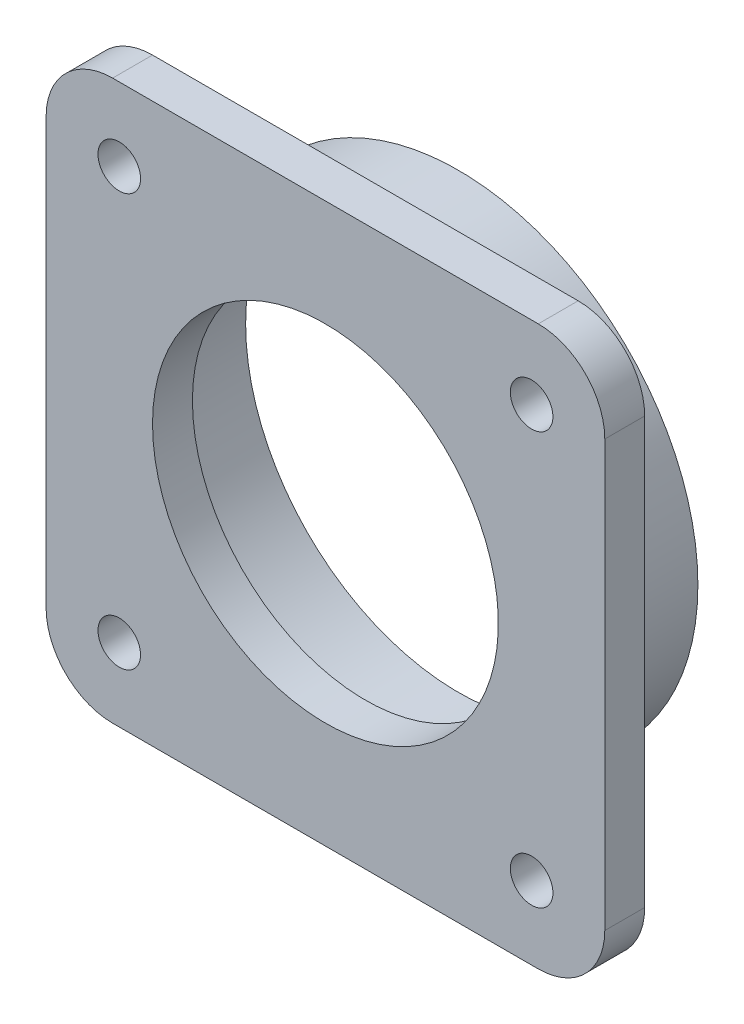
ISO-10303-21;
HEADER;
FILE_DESCRIPTION(('STEP AP214'),'2;1');
FILE_NAME('part.step','',(''),(''),'','','');
FILE_SCHEMA(('AUTOMOTIVE_DESIGN { 1 0 10303 214 1 1 1 1 }'));
ENDSEC;
DATA;
#1=APPLICATION_CONTEXT('core data for automotive mechanical design processes');
#2=APPLICATION_PROTOCOL_DEFINITION('international standard','automotive_design',2000,#1);
#3=PRODUCT_CONTEXT('',#1,'mechanical');
#4=PRODUCT('Part','Part','',(#3));
#5=PRODUCT_RELATED_PRODUCT_CATEGORY('part','',(#4));
#6=PRODUCT_DEFINITION_FORMATION('','',#4);
#7=PRODUCT_DEFINITION_CONTEXT('part definition',#1,'design');
#8=PRODUCT_DEFINITION('design','',#6,#7);
#9=PRODUCT_DEFINITION_SHAPE('','',#8);
#10=(LENGTH_UNIT() NAMED_UNIT(*) SI_UNIT(.MILLI.,.METRE.));
#11=(NAMED_UNIT(*) PLANE_ANGLE_UNIT() SI_UNIT($,.RADIAN.));
#12=(NAMED_UNIT(*) SI_UNIT($,.STERADIAN.) SOLID_ANGLE_UNIT());
#13=UNCERTAINTY_MEASURE_WITH_UNIT(LENGTH_MEASURE(1.E-05),#10,'distance_accuracy_value','');
#14=(GEOMETRIC_REPRESENTATION_CONTEXT(3) GLOBAL_UNCERTAINTY_ASSIGNED_CONTEXT((#13)) GLOBAL_UNIT_ASSIGNED_CONTEXT((#10,
#11,#12)) REPRESENTATION_CONTEXT('',''));
#15=CARTESIAN_POINT('',(0.,0.,0.));
#16=DIRECTION('',(0.,0.,1.));
#17=DIRECTION('',(1.,0.,0.));
#18=AXIS2_PLACEMENT_3D('',#15,#16,#17);
#19=CARTESIAN_POINT('',(0.,0.,0.));
#20=DIRECTION('',(0.,0.,1.));
#21=DIRECTION('',(1.,0.,0.));
#22=AXIS2_PLACEMENT_3D('',#19,#20,#21);
#23=PLANE('',#22);
#24=CARTESIAN_POINT('',(0.,0.,0.));
#25=DIRECTION('',(0.,0.,-1.));
#26=DIRECTION('',(-1.,0.,0.));
#27=AXIS2_PLACEMENT_3D('',#24,#25,#26);
#28=CIRCLE('',#27,13.);
#29=CARTESIAN_POINT('',(-13.,0.,0.));
#30=VERTEX_POINT('',#29);
#31=EDGE_CURVE('E328',#30,#30,#28,.T.);
#32=ORIENTED_EDGE('',*,*,#31,.F.);
#33=EDGE_LOOP('',(#32));
#34=FACE_BOUND('',#33,.T.);
#35=CARTESIAN_POINT('',(0.,0.,0.));
#36=DIRECTION('',(0.,0.,-1.));
#37=DIRECTION('',(-1.,0.,0.));
#38=AXIS2_PLACEMENT_3D('',#35,#36,#37);
#39=CIRCLE('',#38,16.);
#40=CARTESIAN_POINT('',(-16.,0.,0.));
#41=VERTEX_POINT('',#40);
#42=EDGE_CURVE('E320',#41,#41,#39,.T.);
#43=ORIENTED_EDGE('',*,*,#42,.T.);
#44=EDGE_LOOP('',(#43));
#45=FACE_BOUND('',#44,.T.);
#46=ADVANCED_FACE('F46',(#34,#45),#23,.F.);
#47=CARTESIAN_POINT('',(0.,-21.,3.));
#48=DIRECTION('',(0.,1.,0.));
#49=DIRECTION('',(0.,0.,1.));
#50=AXIS2_PLACEMENT_3D('',#47,#48,#49);
#51=PLANE('',#50);
#52=DIRECTION('',(1.,0.,0.));
#53=VECTOR('',#52,1.);
#54=CARTESIAN_POINT('',(0.,-21.,3.));
#55=LINE('',#54,#53);
#56=CARTESIAN_POINT('',(-16.,-21.,3.));
#57=VERTEX_POINT('',#56);
#58=CARTESIAN_POINT('',(16.,-21.,3.));
#59=VERTEX_POINT('',#58);
#60=EDGE_CURVE('E135',#57,#59,#55,.T.);
#61=ORIENTED_EDGE('',*,*,#60,.F.);
#62=DIRECTION('',(0.,0.,-1.));
#63=VECTOR('',#62,1.);
#64=CARTESIAN_POINT('',(-16.,-21.,0.));
#65=LINE('',#64,#63);
#66=CARTESIAN_POINT('',(-16.,-21.,0.));
#67=VERTEX_POINT('',#66);
#68=EDGE_CURVE('E118',#57,#67,#65,.T.);
#69=ORIENTED_EDGE('',*,*,#68,.T.);
#70=DIRECTION('',(1.,0.,0.));
#71=VECTOR('',#70,1.);
#72=CARTESIAN_POINT('',(0.,-21.,0.));
#73=LINE('',#72,#71);
#74=CARTESIAN_POINT('',(16.,-21.,0.));
#75=VERTEX_POINT('',#74);
#76=EDGE_CURVE('E132',#67,#75,#73,.T.);
#77=ORIENTED_EDGE('',*,*,#76,.T.);
#78=DIRECTION('',(0.,0.,-1.));
#79=VECTOR('',#78,1.);
#80=CARTESIAN_POINT('',(16.,-21.,3.));
#81=LINE('',#80,#79);
#82=EDGE_CURVE('E138',#75,#59,#81,.F.);
#83=ORIENTED_EDGE('',*,*,#82,.T.);
#84=EDGE_LOOP('',(#61,#69,#77,#83));
#85=FACE_BOUND('',#84,.T.);
#86=ADVANCED_FACE('F131',(#85),#51,.F.);
#87=CARTESIAN_POINT('',(21.,0.,3.));
#88=DIRECTION('',(-1.,0.,0.));
#89=DIRECTION('',(0.,0.,1.));
#90=AXIS2_PLACEMENT_3D('',#87,#88,#89);
#91=PLANE('',#90);
#92=DIRECTION('',(0.,1.,0.));
#93=VECTOR('',#92,1.);
#94=CARTESIAN_POINT('',(21.,0.,3.));
#95=LINE('',#94,#93);
#96=CARTESIAN_POINT('',(21.,-16.,3.));
#97=VERTEX_POINT('',#96);
#98=CARTESIAN_POINT('',(21.,16.,3.));
#99=VERTEX_POINT('',#98);
#100=EDGE_CURVE('E213',#97,#99,#95,.T.);
#101=ORIENTED_EDGE('',*,*,#100,.F.);
#102=DIRECTION('',(0.,0.,-1.));
#103=VECTOR('',#102,1.);
#104=CARTESIAN_POINT('',(21.,-16.,3.));
#105=LINE('',#104,#103);
#106=CARTESIAN_POINT('',(21.,-16.,0.));
#107=VERTEX_POINT('',#106);
#108=EDGE_CURVE('E192',#97,#107,#105,.T.);
#109=ORIENTED_EDGE('',*,*,#108,.T.);
#110=DIRECTION('',(0.,1.,0.));
#111=VECTOR('',#110,1.);
#112=CARTESIAN_POINT('',(21.,0.,0.));
#113=LINE('',#112,#111);
#114=CARTESIAN_POINT('',(21.,16.,0.));
#115=VERTEX_POINT('',#114);
#116=EDGE_CURVE('E143',#107,#115,#113,.T.);
#117=ORIENTED_EDGE('',*,*,#116,.T.);
#118=DIRECTION('',(0.,0.,-1.));
#119=VECTOR('',#118,1.);
#120=CARTESIAN_POINT('',(21.,16.,3.));
#121=LINE('',#120,#119);
#122=EDGE_CURVE('E189',#115,#99,#121,.F.);
#123=ORIENTED_EDGE('',*,*,#122,.T.);
#124=EDGE_LOOP('',(#101,#109,#117,#123));
#125=FACE_BOUND('',#124,.T.);
#126=ADVANCED_FACE('F255',(#125),#91,.F.);
#127=CARTESIAN_POINT('',(0.,21.,3.));
#128=DIRECTION('',(0.,1.,0.));
#129=DIRECTION('',(0.,0.,1.));
#130=AXIS2_PLACEMENT_3D('',#127,#128,#129);
#131=PLANE('',#130);
#132=DIRECTION('',(1.,0.,0.));
#133=VECTOR('',#132,1.);
#134=CARTESIAN_POINT('',(0.,21.,3.));
#135=LINE('',#134,#133);
#136=CARTESIAN_POINT('',(-16.,21.,3.));
#137=VERTEX_POINT('',#136);
#138=CARTESIAN_POINT('',(16.,21.,3.));
#139=VERTEX_POINT('',#138);
#140=EDGE_CURVE('E201',#137,#139,#135,.T.);
#141=ORIENTED_EDGE('',*,*,#140,.T.);
#142=DIRECTION('',(0.,0.,-1.));
#143=VECTOR('',#142,1.);
#144=CARTESIAN_POINT('',(16.,21.,0.));
#145=LINE('',#144,#143);
#146=CARTESIAN_POINT('',(16.,21.,0.));
#147=VERTEX_POINT('',#146);
#148=EDGE_CURVE('E55',#139,#147,#145,.T.);
#149=ORIENTED_EDGE('',*,*,#148,.T.);
#150=DIRECTION('',(1.,0.,0.));
#151=VECTOR('',#150,1.);
#152=CARTESIAN_POINT('',(0.,21.,0.));
#153=LINE('',#152,#151);
#154=CARTESIAN_POINT('',(-16.,21.,0.));
#155=VERTEX_POINT('',#154);
#156=EDGE_CURVE('E149',#155,#147,#153,.T.);
#157=ORIENTED_EDGE('',*,*,#156,.F.);
#158=DIRECTION('',(0.,0.,-1.));
#159=VECTOR('',#158,1.);
#160=CARTESIAN_POINT('',(-16.,21.,3.));
#161=LINE('',#160,#159);
#162=EDGE_CURVE('E69',#155,#137,#161,.F.);
#163=ORIENTED_EDGE('',*,*,#162,.T.);
#164=EDGE_LOOP('',(#141,#149,#157,#163));
#165=FACE_BOUND('',#164,.T.);
#166=ADVANCED_FACE('F200',(#165),#131,.T.);
#167=CARTESIAN_POINT('',(-15.5,15.5,3.));
#168=DIRECTION('',(0.,0.,-1.));
#169=DIRECTION('',(-1.,0.,0.));
#170=AXIS2_PLACEMENT_3D('',#167,#168,#169);
#171=CYLINDRICAL_SURFACE('',#170,1.6);
#172=CARTESIAN_POINT('',(-15.5,15.5,3.));
#173=DIRECTION('',(0.,0.,1.));
#174=DIRECTION('',(1.,0.,0.));
#175=AXIS2_PLACEMENT_3D('',#172,#173,#174);
#176=CIRCLE('',#175,1.6);
#177=CARTESIAN_POINT('',(-13.9,15.5,3.));
#178=VERTEX_POINT('',#177);
#179=EDGE_CURVE('E301',#178,#178,#176,.T.);
#180=ORIENTED_EDGE('',*,*,#179,.T.);
#181=EDGE_LOOP('',(#180));
#182=FACE_BOUND('',#181,.T.);
#183=CARTESIAN_POINT('',(-15.5,15.5,0.));
#184=DIRECTION('',(0.,0.,1.));
#185=DIRECTION('',(1.,0.,0.));
#186=AXIS2_PLACEMENT_3D('',#183,#184,#185);
#187=CIRCLE('',#186,1.6);
#188=CARTESIAN_POINT('',(-13.9,15.5,0.));
#189=VERTEX_POINT('',#188);
#190=EDGE_CURVE('E144',#189,#189,#187,.T.);
#191=ORIENTED_EDGE('',*,*,#190,.F.);
#192=EDGE_LOOP('',(#191));
#193=FACE_BOUND('',#192,.T.);
#194=ADVANCED_FACE('F234',(#182,#193),#171,.F.);
#195=CARTESIAN_POINT('',(-15.5000000000002,-15.4999999999998,3.));
#196=DIRECTION('',(0.,0.,-1.));
#197=DIRECTION('',(-1.,0.,0.));
#198=AXIS2_PLACEMENT_3D('',#195,#196,#197);
#199=CYLINDRICAL_SURFACE('',#198,1.6);
#200=CARTESIAN_POINT('',(-15.5000000000002,-15.4999999999998,3.));
#201=DIRECTION('',(0.,0.,1.));
#202=DIRECTION('',(1.,0.,0.));
#203=AXIS2_PLACEMENT_3D('',#200,#201,#202);
#204=CIRCLE('',#203,1.6);
#205=CARTESIAN_POINT('',(-13.9000000000002,-15.4999999999998,3.));
#206=VERTEX_POINT('',#205);
#207=EDGE_CURVE('E307',#206,#206,#204,.T.);
#208=ORIENTED_EDGE('',*,*,#207,.T.);
#209=EDGE_LOOP('',(#208));
#210=FACE_BOUND('',#209,.T.);
#211=CARTESIAN_POINT('',(-15.5000000000002,-15.4999999999998,0.));
#212=DIRECTION('',(0.,0.,1.));
#213=DIRECTION('',(1.,0.,0.));
#214=AXIS2_PLACEMENT_3D('',#211,#212,#213);
#215=CIRCLE('',#214,1.6);
#216=CARTESIAN_POINT('',(-13.9000000000002,-15.4999999999998,0.));
#217=VERTEX_POINT('',#216);
#218=EDGE_CURVE('E152',#217,#217,#215,.T.);
#219=ORIENTED_EDGE('',*,*,#218,.F.);
#220=EDGE_LOOP('',(#219));
#221=FACE_BOUND('',#220,.T.);
#222=ADVANCED_FACE('F231',(#210,#221),#199,.F.);
#223=CARTESIAN_POINT('',(15.5000000000001,15.4999999999999,3.));
#224=DIRECTION('',(0.,0.,-1.));
#225=DIRECTION('',(-1.,0.,0.));
#226=AXIS2_PLACEMENT_3D('',#223,#224,#225);
#227=CYLINDRICAL_SURFACE('',#226,1.6);
#228=CARTESIAN_POINT('',(15.5000000000001,15.4999999999999,3.));
#229=DIRECTION('',(0.,0.,1.));
#230=DIRECTION('',(1.,0.,0.));
#231=AXIS2_PLACEMENT_3D('',#228,#229,#230);
#232=CIRCLE('',#231,1.6);
#233=CARTESIAN_POINT('',(17.1000000000001,15.4999999999999,3.));
#234=VERTEX_POINT('',#233);
#235=EDGE_CURVE('E310',#234,#234,#232,.T.);
#236=ORIENTED_EDGE('',*,*,#235,.T.);
#237=EDGE_LOOP('',(#236));
#238=FACE_BOUND('',#237,.T.);
#239=CARTESIAN_POINT('',(15.5000000000001,15.4999999999999,0.));
#240=DIRECTION('',(0.,0.,1.));
#241=DIRECTION('',(1.,0.,0.));
#242=AXIS2_PLACEMENT_3D('',#239,#240,#241);
#243=CIRCLE('',#242,1.6);
#244=CARTESIAN_POINT('',(17.1000000000001,15.4999999999999,0.));
#245=VERTEX_POINT('',#244);
#246=EDGE_CURVE('E221',#245,#245,#243,.T.);
#247=ORIENTED_EDGE('',*,*,#246,.F.);
#248=EDGE_LOOP('',(#247));
#249=FACE_BOUND('',#248,.T.);
#250=ADVANCED_FACE('F233',(#238,#249),#227,.F.);
#251=CARTESIAN_POINT('',(15.4999999999999,-15.5000000000001,3.));
#252=DIRECTION('',(0.,0.,-1.));
#253=DIRECTION('',(-1.,0.,0.));
#254=AXIS2_PLACEMENT_3D('',#251,#252,#253);
#255=CYLINDRICAL_SURFACE('',#254,1.6);
#256=CARTESIAN_POINT('',(15.4999999999999,-15.5000000000001,3.));
#257=DIRECTION('',(0.,0.,1.));
#258=DIRECTION('',(1.,0.,0.));
#259=AXIS2_PLACEMENT_3D('',#256,#257,#258);
#260=CIRCLE('',#259,1.6);
#261=CARTESIAN_POINT('',(17.0999999999999,-15.5000000000001,3.));
#262=VERTEX_POINT('',#261);
#263=EDGE_CURVE('E162',#262,#262,#260,.T.);
#264=ORIENTED_EDGE('',*,*,#263,.T.);
#265=EDGE_LOOP('',(#264));
#266=FACE_BOUND('',#265,.T.);
#267=CARTESIAN_POINT('',(15.4999999999999,-15.5000000000001,0.));
#268=DIRECTION('',(0.,0.,1.));
#269=DIRECTION('',(1.,0.,0.));
#270=AXIS2_PLACEMENT_3D('',#267,#268,#269);
#271=CIRCLE('',#270,1.6);
#272=CARTESIAN_POINT('',(17.0999999999999,-15.5000000000001,0.));
#273=VERTEX_POINT('',#272);
#274=EDGE_CURVE('E217',#273,#273,#271,.T.);
#275=ORIENTED_EDGE('',*,*,#274,.F.);
#276=EDGE_LOOP('',(#275));
#277=FACE_BOUND('',#276,.T.);
#278=ADVANCED_FACE('F241',(#266,#277),#255,.F.);
#279=CARTESIAN_POINT('',(-21.,0.,3.));
#280=DIRECTION('',(-1.,0.,0.));
#281=DIRECTION('',(0.,0.,1.));
#282=AXIS2_PLACEMENT_3D('',#279,#280,#281);
#283=PLANE('',#282);
#284=DIRECTION('',(0.,1.,0.));
#285=VECTOR('',#284,1.);
#286=CARTESIAN_POINT('',(-21.,0.,0.));
#287=LINE('',#286,#285);
#288=CARTESIAN_POINT('',(-21.,-16.,0.));
#289=VERTEX_POINT('',#288);
#290=CARTESIAN_POINT('',(-21.,16.,0.));
#291=VERTEX_POINT('',#290);
#292=EDGE_CURVE('E159',#289,#291,#287,.T.);
#293=ORIENTED_EDGE('',*,*,#292,.F.);
#294=DIRECTION('',(0.,0.,-1.));
#295=VECTOR('',#294,1.);
#296=CARTESIAN_POINT('',(-21.,-16.,3.));
#297=LINE('',#296,#295);
#298=CARTESIAN_POINT('',(-21.,-16.,3.));
#299=VERTEX_POINT('',#298);
#300=EDGE_CURVE('E119',#289,#299,#297,.F.);
#301=ORIENTED_EDGE('',*,*,#300,.T.);
#302=DIRECTION('',(0.,1.,0.));
#303=VECTOR('',#302,1.);
#304=CARTESIAN_POINT('',(-21.,0.,3.));
#305=LINE('',#304,#303);
#306=CARTESIAN_POINT('',(-21.,16.,3.));
#307=VERTEX_POINT('',#306);
#308=EDGE_CURVE('E164',#299,#307,#305,.T.);
#309=ORIENTED_EDGE('',*,*,#308,.T.);
#310=DIRECTION('',(0.,0.,-1.));
#311=VECTOR('',#310,1.);
#312=CARTESIAN_POINT('',(-21.,16.,3.));
#313=LINE('',#312,#311);
#314=EDGE_CURVE('E125',#307,#291,#313,.T.);
#315=ORIENTED_EDGE('',*,*,#314,.T.);
#316=EDGE_LOOP('',(#293,#301,#309,#315));
#317=FACE_BOUND('',#316,.T.);
#318=ADVANCED_FACE('F208',(#317),#283,.T.);
#319=CARTESIAN_POINT('',(0.,0.,3.));
#320=DIRECTION('',(0.,0.,1.));
#321=DIRECTION('',(1.,0.,0.));
#322=AXIS2_PLACEMENT_3D('',#319,#320,#321);
#323=PLANE('',#322);
#324=CARTESIAN_POINT('',(0.,0.,3.));
#325=DIRECTION('',(0.,0.,-1.));
#326=DIRECTION('',(-1.,0.,0.));
#327=AXIS2_PLACEMENT_3D('',#324,#325,#326);
#328=CIRCLE('',#327,13.);
#329=CARTESIAN_POINT('',(-13.,0.,3.));
#330=VERTEX_POINT('',#329);
#331=EDGE_CURVE('E324',#330,#330,#328,.T.);
#332=ORIENTED_EDGE('',*,*,#331,.T.);
#333=EDGE_LOOP('',(#332));
#334=FACE_BOUND('',#333,.T.);
#335=ORIENTED_EDGE('',*,*,#263,.F.);
#336=EDGE_LOOP('',(#335));
#337=FACE_BOUND('',#336,.T.);
#338=ORIENTED_EDGE('',*,*,#235,.F.);
#339=EDGE_LOOP('',(#338));
#340=FACE_BOUND('',#339,.T.);
#341=ORIENTED_EDGE('',*,*,#207,.F.);
#342=EDGE_LOOP('',(#341));
#343=FACE_BOUND('',#342,.T.);
#344=ORIENTED_EDGE('',*,*,#179,.F.);
#345=EDGE_LOOP('',(#344));
#346=FACE_BOUND('',#345,.T.);
#347=ORIENTED_EDGE('',*,*,#308,.F.);
#348=CARTESIAN_POINT('',(-16.,-16.,3.));
#349=DIRECTION('',(0.,0.,1.));
#350=DIRECTION('',(1.,0.,0.));
#351=AXIS2_PLACEMENT_3D('',#348,#349,#350);
#352=CIRCLE('',#351,5.);
#353=EDGE_CURVE('E186',#299,#57,#352,.T.);
#354=ORIENTED_EDGE('',*,*,#353,.T.);
#355=ORIENTED_EDGE('',*,*,#60,.T.);
#356=CARTESIAN_POINT('',(16.,-16.,3.));
#357=DIRECTION('',(0.,0.,1.));
#358=DIRECTION('',(1.,0.,0.));
#359=AXIS2_PLACEMENT_3D('',#356,#357,#358);
#360=CIRCLE('',#359,5.);
#361=EDGE_CURVE('E183',#59,#97,#360,.T.);
#362=ORIENTED_EDGE('',*,*,#361,.T.);
#363=ORIENTED_EDGE('',*,*,#100,.T.);
#364=CARTESIAN_POINT('',(16.,16.,3.));
#365=DIRECTION('',(0.,0.,1.));
#366=DIRECTION('',(1.,0.,0.));
#367=AXIS2_PLACEMENT_3D('',#364,#365,#366);
#368=CIRCLE('',#367,5.);
#369=EDGE_CURVE('E62',#99,#139,#368,.T.);
#370=ORIENTED_EDGE('',*,*,#369,.T.);
#371=ORIENTED_EDGE('',*,*,#140,.F.);
#372=CARTESIAN_POINT('',(-16.,16.,3.));
#373=DIRECTION('',(0.,0.,1.));
#374=DIRECTION('',(1.,0.,0.));
#375=AXIS2_PLACEMENT_3D('',#372,#373,#374);
#376=CIRCLE('',#375,5.);
#377=EDGE_CURVE('E178',#137,#307,#376,.T.);
#378=ORIENTED_EDGE('',*,*,#377,.T.);
#379=EDGE_LOOP('',(#347,#354,#355,#362,#363,#370,#371,#378));
#380=FACE_BOUND('',#379,.T.);
#381=ADVANCED_FACE('F262',(#334,#337,#340,#343,#346,#380),#323,.T.);
#382=CARTESIAN_POINT('',(0.,0.,0.));
#383=DIRECTION('',(0.,0.,1.));
#384=DIRECTION('',(1.,0.,0.));
#385=AXIS2_PLACEMENT_3D('',#382,#383,#384);
#386=CIRCLE('',#385,18.);
#387=CARTESIAN_POINT('',(18.,0.,0.));
#388=VERTEX_POINT('',#387);
#389=EDGE_CURVE('E11',#388,#388,#386,.F.);
#390=ORIENTED_EDGE('',*,*,#389,.F.);
#391=EDGE_LOOP('',(#390));
#392=FACE_BOUND('',#391,.T.);
#393=ORIENTED_EDGE('',*,*,#274,.T.);
#394=EDGE_LOOP('',(#393));
#395=FACE_BOUND('',#394,.T.);
#396=ORIENTED_EDGE('',*,*,#246,.T.);
#397=EDGE_LOOP('',(#396));
#398=FACE_BOUND('',#397,.T.);
#399=ORIENTED_EDGE('',*,*,#218,.T.);
#400=EDGE_LOOP('',(#399));
#401=FACE_BOUND('',#400,.T.);
#402=ORIENTED_EDGE('',*,*,#190,.T.);
#403=EDGE_LOOP('',(#402));
#404=FACE_BOUND('',#403,.T.);
#405=ORIENTED_EDGE('',*,*,#76,.F.);
#406=CARTESIAN_POINT('',(-16.,-16.,0.));
#407=DIRECTION('',(0.,0.,1.));
#408=DIRECTION('',(1.,0.,0.));
#409=AXIS2_PLACEMENT_3D('',#406,#407,#408);
#410=CIRCLE('',#409,5.);
#411=EDGE_CURVE('E114',#67,#289,#410,.F.);
#412=ORIENTED_EDGE('',*,*,#411,.T.);
#413=ORIENTED_EDGE('',*,*,#292,.T.);
#414=CARTESIAN_POINT('',(-16.,16.,0.));
#415=DIRECTION('',(0.,0.,1.));
#416=DIRECTION('',(1.,0.,0.));
#417=AXIS2_PLACEMENT_3D('',#414,#415,#416);
#418=CIRCLE('',#417,5.);
#419=EDGE_CURVE('E137',#291,#155,#418,.F.);
#420=ORIENTED_EDGE('',*,*,#419,.T.);
#421=ORIENTED_EDGE('',*,*,#156,.T.);
#422=CARTESIAN_POINT('',(16.,16.,0.));
#423=DIRECTION('',(0.,0.,1.));
#424=DIRECTION('',(1.,0.,0.));
#425=AXIS2_PLACEMENT_3D('',#422,#423,#424);
#426=CIRCLE('',#425,5.);
#427=EDGE_CURVE('E168',#147,#115,#426,.F.);
#428=ORIENTED_EDGE('',*,*,#427,.T.);
#429=ORIENTED_EDGE('',*,*,#116,.F.);
#430=CARTESIAN_POINT('',(16.,-16.,0.));
#431=DIRECTION('',(0.,0.,1.));
#432=DIRECTION('',(1.,0.,0.));
#433=AXIS2_PLACEMENT_3D('',#430,#431,#432);
#434=CIRCLE('',#433,5.);
#435=EDGE_CURVE('E126',#107,#75,#434,.F.);
#436=ORIENTED_EDGE('',*,*,#435,.T.);
#437=EDGE_LOOP('',(#405,#412,#413,#420,#421,#428,#429,#436));
#438=FACE_BOUND('',#437,.T.);
#439=ADVANCED_FACE('F140',(#392,#395,#398,#401,#404,#438),#23,.F.);
#440=CARTESIAN_POINT('',(-16.,-16.,3.));
#441=DIRECTION('',(0.,0.,1.));
#442=DIRECTION('',(1.,0.,0.));
#443=AXIS2_PLACEMENT_3D('',#440,#441,#442);
#444=CYLINDRICAL_SURFACE('',#443,5.);
#445=ORIENTED_EDGE('',*,*,#353,.F.);
#446=ORIENTED_EDGE('',*,*,#300,.F.);
#447=ORIENTED_EDGE('',*,*,#411,.F.);
#448=ORIENTED_EDGE('',*,*,#68,.F.);
#449=EDGE_LOOP('',(#445,#446,#447,#448));
#450=FACE_BOUND('',#449,.T.);
#451=ADVANCED_FACE('F117',(#450),#444,.T.);
#452=CARTESIAN_POINT('',(16.,-16.,3.));
#453=DIRECTION('',(0.,0.,-1.));
#454=DIRECTION('',(-1.,0.,0.));
#455=AXIS2_PLACEMENT_3D('',#452,#453,#454);
#456=CYLINDRICAL_SURFACE('',#455,5.);
#457=ORIENTED_EDGE('',*,*,#361,.F.);
#458=ORIENTED_EDGE('',*,*,#82,.F.);
#459=ORIENTED_EDGE('',*,*,#435,.F.);
#460=ORIENTED_EDGE('',*,*,#108,.F.);
#461=EDGE_LOOP('',(#457,#458,#459,#460));
#462=FACE_BOUND('',#461,.T.);
#463=ADVANCED_FACE('F269',(#462),#456,.T.);
#464=CARTESIAN_POINT('',(16.,16.,3.));
#465=DIRECTION('',(0.,0.,1.));
#466=DIRECTION('',(1.,0.,0.));
#467=AXIS2_PLACEMENT_3D('',#464,#465,#466);
#468=CYLINDRICAL_SURFACE('',#467,5.);
#469=ORIENTED_EDGE('',*,*,#369,.F.);
#470=ORIENTED_EDGE('',*,*,#122,.F.);
#471=ORIENTED_EDGE('',*,*,#427,.F.);
#472=ORIENTED_EDGE('',*,*,#148,.F.);
#473=EDGE_LOOP('',(#469,#470,#471,#472));
#474=FACE_BOUND('',#473,.T.);
#475=ADVANCED_FACE('F288',(#474),#468,.T.);
#476=CARTESIAN_POINT('',(-16.,16.,3.));
#477=DIRECTION('',(0.,0.,-1.));
#478=DIRECTION('',(-1.,0.,0.));
#479=AXIS2_PLACEMENT_3D('',#476,#477,#478);
#480=CYLINDRICAL_SURFACE('',#479,5.);
#481=ORIENTED_EDGE('',*,*,#377,.F.);
#482=ORIENTED_EDGE('',*,*,#162,.F.);
#483=ORIENTED_EDGE('',*,*,#419,.F.);
#484=ORIENTED_EDGE('',*,*,#314,.F.);
#485=EDGE_LOOP('',(#481,#482,#483,#484));
#486=FACE_BOUND('',#485,.T.);
#487=ADVANCED_FACE('F48',(#486),#480,.T.);
#488=CARTESIAN_POINT('',(0.,0.,-7.));
#489=DIRECTION('',(0.,0.,-1.));
#490=DIRECTION('',(-1.,0.,0.));
#491=AXIS2_PLACEMENT_3D('',#488,#489,#490);
#492=PLANE('',#491);
#493=CARTESIAN_POINT('',(0.,0.,-7.));
#494=DIRECTION('',(0.,0.,-1.));
#495=DIRECTION('',(-1.,0.,0.));
#496=AXIS2_PLACEMENT_3D('',#493,#494,#495);
#497=CIRCLE('',#496,18.);
#498=CARTESIAN_POINT('',(-18.,0.,-7.));
#499=VERTEX_POINT('',#498);
#500=EDGE_CURVE('E222',#499,#499,#497,.T.);
#501=ORIENTED_EDGE('',*,*,#500,.T.);
#502=EDGE_LOOP('',(#501));
#503=FACE_BOUND('',#502,.T.);
#504=CARTESIAN_POINT('',(0.,0.,-7.));
#505=DIRECTION('',(0.,0.,-1.));
#506=DIRECTION('',(-1.,0.,0.));
#507=AXIS2_PLACEMENT_3D('',#504,#505,#506);
#508=CIRCLE('',#507,16.);
#509=CARTESIAN_POINT('',(-16.,0.,-7.));
#510=VERTEX_POINT('',#509);
#511=EDGE_CURVE('E319',#510,#510,#508,.T.);
#512=ORIENTED_EDGE('',*,*,#511,.F.);
#513=EDGE_LOOP('',(#512));
#514=FACE_BOUND('',#513,.T.);
#515=ADVANCED_FACE('F293',(#503,#514),#492,.T.);
#516=CARTESIAN_POINT('',(0.,0.,-7.));
#517=DIRECTION('',(0.,0.,1.));
#518=DIRECTION('',(1.,0.,0.));
#519=AXIS2_PLACEMENT_3D('',#516,#517,#518);
#520=CYLINDRICAL_SURFACE('',#519,18.);
#521=ORIENTED_EDGE('',*,*,#500,.F.);
#522=EDGE_LOOP('',(#521));
#523=FACE_BOUND('',#522,.T.);
#524=ORIENTED_EDGE('',*,*,#389,.T.);
#525=EDGE_LOOP('',(#524));
#526=FACE_BOUND('',#525,.T.);
#527=ADVANCED_FACE('F344',(#523,#526),#520,.T.);
#528=CARTESIAN_POINT('',(0.,0.,-7.));
#529=DIRECTION('',(0.,0.,1.));
#530=DIRECTION('',(1.,0.,0.));
#531=AXIS2_PLACEMENT_3D('',#528,#529,#530);
#532=CYLINDRICAL_SURFACE('',#531,16.);
#533=ORIENTED_EDGE('',*,*,#511,.T.);
#534=EDGE_LOOP('',(#533));
#535=FACE_BOUND('',#534,.T.);
#536=ORIENTED_EDGE('',*,*,#42,.F.);
#537=EDGE_LOOP('',(#536));
#538=FACE_BOUND('',#537,.T.);
#539=ADVANCED_FACE('F340',(#535,#538),#532,.F.);
#540=CARTESIAN_POINT('',(0.,0.,3.));
#541=DIRECTION('',(0.,0.,-1.));
#542=DIRECTION('',(-1.,0.,0.));
#543=AXIS2_PLACEMENT_3D('',#540,#541,#542);
#544=CYLINDRICAL_SURFACE('',#543,13.);
#545=ORIENTED_EDGE('',*,*,#331,.F.);
#546=EDGE_LOOP('',(#545));
#547=FACE_BOUND('',#546,.T.);
#548=ORIENTED_EDGE('',*,*,#31,.T.);
#549=EDGE_LOOP('',(#548));
#550=FACE_BOUND('',#549,.T.);
#551=ADVANCED_FACE('F337',(#547,#550),#544,.F.);
#552=CLOSED_SHELL('',(#46,#86,#126,#166,#194,#222,#250,#278,#318,#381,#439,#451,#463,#475,#487,
#515,#527,#539,#551));
#553=MANIFOLD_SOLID_BREP('B2',#552);
#554=ADVANCED_BREP_SHAPE_REPRESENTATION('',(#18,#553),#14);
#555=SHAPE_DEFINITION_REPRESENTATION(#9,#554);
ENDSEC;
END-ISO-10303-21;
